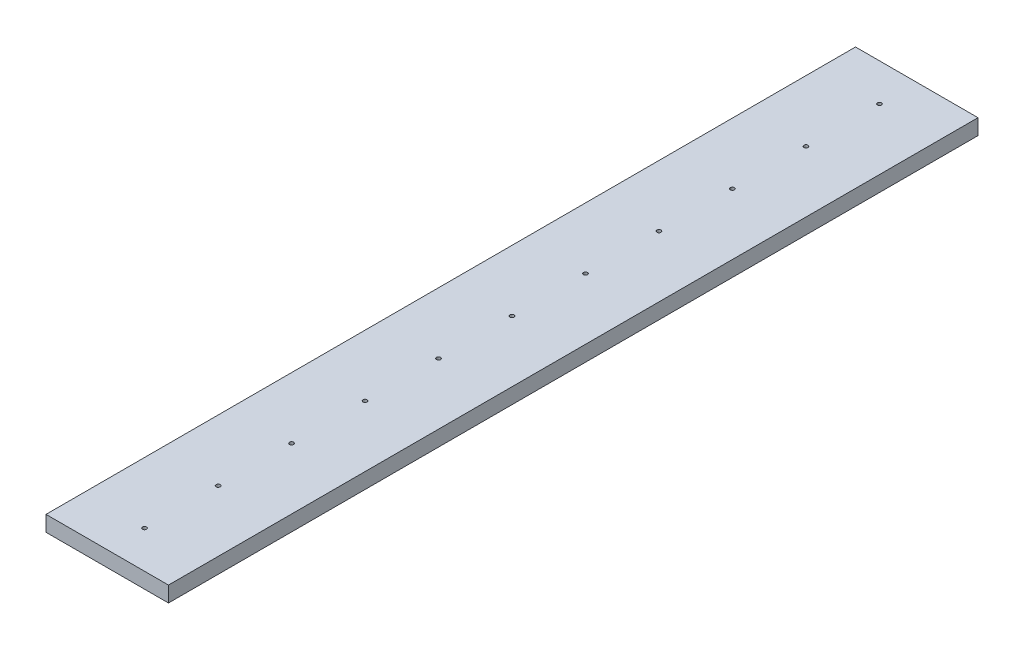
ISO-10303-21;
HEADER;
FILE_DESCRIPTION(('STEP AP214'),'2;1');
FILE_NAME('part.step','',(''),(''),'','','');
FILE_SCHEMA(('AUTOMOTIVE_DESIGN { 1 0 10303 214 1 1 1 1 }'));
ENDSEC;
DATA;
#1=APPLICATION_CONTEXT('core data for automotive mechanical design processes');
#2=APPLICATION_PROTOCOL_DEFINITION('international standard','automotive_design',2000,#1);
#3=PRODUCT_CONTEXT('',#1,'mechanical');
#4=PRODUCT('Part','Part','',(#3));
#5=PRODUCT_RELATED_PRODUCT_CATEGORY('part','',(#4));
#6=PRODUCT_DEFINITION_FORMATION('','',#4);
#7=PRODUCT_DEFINITION_CONTEXT('part definition',#1,'design');
#8=PRODUCT_DEFINITION('design','',#6,#7);
#9=PRODUCT_DEFINITION_SHAPE('','',#8);
#10=(LENGTH_UNIT() NAMED_UNIT(*) SI_UNIT(.MILLI.,.METRE.));
#11=(NAMED_UNIT(*) PLANE_ANGLE_UNIT() SI_UNIT($,.RADIAN.));
#12=(NAMED_UNIT(*) SI_UNIT($,.STERADIAN.) SOLID_ANGLE_UNIT());
#13=UNCERTAINTY_MEASURE_WITH_UNIT(LENGTH_MEASURE(1.E-05),#10,'distance_accuracy_value','');
#14=(GEOMETRIC_REPRESENTATION_CONTEXT(3) GLOBAL_UNCERTAINTY_ASSIGNED_CONTEXT((#13)) GLOBAL_UNIT_ASSIGNED_CONTEXT((#10,
#11,#12)) REPRESENTATION_CONTEXT('',''));
#15=CARTESIAN_POINT('',(0.,0.,0.));
#16=DIRECTION('',(0.,0.,1.));
#17=DIRECTION('',(1.,0.,0.));
#18=AXIS2_PLACEMENT_3D('',#15,#16,#17);
#19=CARTESIAN_POINT('',(-50.,12.7,-330.5));
#20=DIRECTION('',(1.,0.,0.));
#21=DIRECTION('',(0.,0.,-1.));
#22=AXIS2_PLACEMENT_3D('',#19,#20,#21);
#23=PLANE('',#22);
#24=DIRECTION('',(0.,0.,1.));
#25=VECTOR('',#24,1.);
#26=CARTESIAN_POINT('',(-50.,0.,-330.5));
#27=LINE('',#26,#25);
#28=CARTESIAN_POINT('',(-50.,0.,-330.5));
#29=VERTEX_POINT('',#28);
#30=CARTESIAN_POINT('',(-50.,0.,330.5));
#31=VERTEX_POINT('',#30);
#32=EDGE_CURVE('E229',#29,#31,#27,.T.);
#33=ORIENTED_EDGE('',*,*,#32,.T.);
#34=DIRECTION('',(0.,-1.,0.));
#35=VECTOR('',#34,1.);
#36=CARTESIAN_POINT('',(-50.,12.7,330.5));
#37=LINE('',#36,#35);
#38=CARTESIAN_POINT('',(-50.,12.7,330.5));
#39=VERTEX_POINT('',#38);
#40=EDGE_CURVE('E11',#39,#31,#37,.T.);
#41=ORIENTED_EDGE('',*,*,#40,.F.);
#42=DIRECTION('',(0.,0.,1.));
#43=VECTOR('',#42,1.);
#44=CARTESIAN_POINT('',(-50.,12.7,-330.5));
#45=LINE('',#44,#43);
#46=CARTESIAN_POINT('',(-50.,12.7,-330.5));
#47=VERTEX_POINT('',#46);
#48=EDGE_CURVE('E231',#47,#39,#45,.T.);
#49=ORIENTED_EDGE('',*,*,#48,.F.);
#50=DIRECTION('',(0.,-1.,0.));
#51=VECTOR('',#50,1.);
#52=CARTESIAN_POINT('',(-50.,12.7,-330.5));
#53=LINE('',#52,#51);
#54=EDGE_CURVE('E243',#47,#29,#53,.T.);
#55=ORIENTED_EDGE('',*,*,#54,.T.);
#56=EDGE_LOOP('',(#33,#41,#49,#55));
#57=FACE_BOUND('',#56,.T.);
#58=ADVANCED_FACE('F51',(#57),#23,.F.);
#59=CARTESIAN_POINT('',(50.,12.7,330.5));
#60=DIRECTION('',(0.,0.,-1.));
#61=DIRECTION('',(-1.,0.,0.));
#62=AXIS2_PLACEMENT_3D('',#59,#60,#61);
#63=PLANE('',#62);
#64=DIRECTION('',(1.,0.,0.));
#65=VECTOR('',#64,1.);
#66=CARTESIAN_POINT('',(50.,0.,330.5));
#67=LINE('',#66,#65);
#68=CARTESIAN_POINT('',(50.,0.,330.5));
#69=VERTEX_POINT('',#68);
#70=EDGE_CURVE('E244',#31,#69,#67,.T.);
#71=ORIENTED_EDGE('',*,*,#70,.T.);
#72=DIRECTION('',(0.,-1.,0.));
#73=VECTOR('',#72,1.);
#74=CARTESIAN_POINT('',(50.,12.7,330.5));
#75=LINE('',#74,#73);
#76=CARTESIAN_POINT('',(50.,12.7,330.5));
#77=VERTEX_POINT('',#76);
#78=EDGE_CURVE('E58',#77,#69,#75,.T.);
#79=ORIENTED_EDGE('',*,*,#78,.F.);
#80=DIRECTION('',(1.,0.,0.));
#81=VECTOR('',#80,1.);
#82=CARTESIAN_POINT('',(50.,12.7,330.5));
#83=LINE('',#82,#81);
#84=EDGE_CURVE('E98',#39,#77,#83,.T.);
#85=ORIENTED_EDGE('',*,*,#84,.F.);
#86=ORIENTED_EDGE('',*,*,#40,.T.);
#87=EDGE_LOOP('',(#71,#79,#85,#86));
#88=FACE_BOUND('',#87,.T.);
#89=ADVANCED_FACE('F276',(#88),#63,.F.);
#90=CARTESIAN_POINT('',(50.,12.7,-330.5));
#91=DIRECTION('',(-1.,0.,0.));
#92=DIRECTION('',(0.,0.,1.));
#93=AXIS2_PLACEMENT_3D('',#90,#91,#92);
#94=PLANE('',#93);
#95=DIRECTION('',(0.,0.,-1.));
#96=VECTOR('',#95,1.);
#97=CARTESIAN_POINT('',(50.,0.,-330.5));
#98=LINE('',#97,#96);
#99=CARTESIAN_POINT('',(50.,0.,-330.5));
#100=VERTEX_POINT('',#99);
#101=EDGE_CURVE('E86',#69,#100,#98,.T.);
#102=ORIENTED_EDGE('',*,*,#101,.T.);
#103=DIRECTION('',(0.,-1.,0.));
#104=VECTOR('',#103,1.);
#105=CARTESIAN_POINT('',(50.,12.7,-330.5));
#106=LINE('',#105,#104);
#107=CARTESIAN_POINT('',(50.,12.7,-330.5));
#108=VERTEX_POINT('',#107);
#109=EDGE_CURVE('E252',#108,#100,#106,.T.);
#110=ORIENTED_EDGE('',*,*,#109,.F.);
#111=DIRECTION('',(0.,0.,-1.));
#112=VECTOR('',#111,1.);
#113=CARTESIAN_POINT('',(50.,12.7,-330.5));
#114=LINE('',#113,#112);
#115=EDGE_CURVE('E237',#77,#108,#114,.T.);
#116=ORIENTED_EDGE('',*,*,#115,.F.);
#117=ORIENTED_EDGE('',*,*,#78,.T.);
#118=EDGE_LOOP('',(#102,#110,#116,#117));
#119=FACE_BOUND('',#118,.T.);
#120=ADVANCED_FACE('F256',(#119),#94,.F.);
#121=CARTESIAN_POINT('',(50.,12.7,-330.5));
#122=DIRECTION('',(0.,0.,1.));
#123=DIRECTION('',(1.,0.,0.));
#124=AXIS2_PLACEMENT_3D('',#121,#122,#123);
#125=PLANE('',#124);
#126=DIRECTION('',(-1.,0.,0.));
#127=VECTOR('',#126,1.);
#128=CARTESIAN_POINT('',(50.,0.,-330.5));
#129=LINE('',#128,#127);
#130=EDGE_CURVE('E95',#100,#29,#129,.T.);
#131=ORIENTED_EDGE('',*,*,#130,.T.);
#132=ORIENTED_EDGE('',*,*,#54,.F.);
#133=DIRECTION('',(-1.,0.,0.));
#134=VECTOR('',#133,1.);
#135=CARTESIAN_POINT('',(50.,12.7,-330.5));
#136=LINE('',#135,#134);
#137=EDGE_CURVE('E66',#108,#47,#136,.T.);
#138=ORIENTED_EDGE('',*,*,#137,.F.);
#139=ORIENTED_EDGE('',*,*,#109,.T.);
#140=EDGE_LOOP('',(#131,#132,#138,#139));
#141=FACE_BOUND('',#140,.T.);
#142=ADVANCED_FACE('F262',(#141),#125,.F.);
#143=CARTESIAN_POINT('',(0.,12.7,0.));
#144=DIRECTION('',(0.,-1.,0.));
#145=DIRECTION('',(0.,0.,-1.));
#146=AXIS2_PLACEMENT_3D('',#143,#144,#145);
#147=PLANE('',#146);
#148=CARTESIAN_POINT('',(0.,12.7,0.));
#149=DIRECTION('',(0.,1.,0.));
#150=DIRECTION('',(0.,0.,1.));
#151=AXIS2_PLACEMENT_3D('',#148,#149,#150);
#152=CIRCLE('',#151,1.65);
#153=CARTESIAN_POINT('',(0.,12.7,1.65));
#154=VERTEX_POINT('',#153);
#155=EDGE_CURVE('E144',#154,#154,#152,.T.);
#156=ORIENTED_EDGE('',*,*,#155,.F.);
#157=EDGE_LOOP('',(#156));
#158=FACE_BOUND('',#157,.T.);
#159=CARTESIAN_POINT('',(0.,12.7,300.));
#160=DIRECTION('',(0.,1.,0.));
#161=DIRECTION('',(0.,0.,1.));
#162=AXIS2_PLACEMENT_3D('',#159,#160,#161);
#163=CIRCLE('',#162,1.65);
#164=CARTESIAN_POINT('',(0.,12.7,301.65));
#165=VERTEX_POINT('',#164);
#166=EDGE_CURVE('E143',#165,#165,#163,.T.);
#167=ORIENTED_EDGE('',*,*,#166,.F.);
#168=EDGE_LOOP('',(#167));
#169=FACE_BOUND('',#168,.T.);
#170=CARTESIAN_POINT('',(0.,12.7,240.));
#171=DIRECTION('',(0.,1.,0.));
#172=DIRECTION('',(0.,0.,1.));
#173=AXIS2_PLACEMENT_3D('',#170,#171,#172);
#174=CIRCLE('',#173,1.65);
#175=CARTESIAN_POINT('',(0.,12.7,241.65));
#176=VERTEX_POINT('',#175);
#177=EDGE_CURVE('E156',#176,#176,#174,.T.);
#178=ORIENTED_EDGE('',*,*,#177,.F.);
#179=EDGE_LOOP('',(#178));
#180=FACE_BOUND('',#179,.T.);
#181=CARTESIAN_POINT('',(0.,12.7,180.));
#182=DIRECTION('',(0.,1.,0.));
#183=DIRECTION('',(0.,0.,1.));
#184=AXIS2_PLACEMENT_3D('',#181,#182,#183);
#185=CIRCLE('',#184,1.65);
#186=CARTESIAN_POINT('',(0.,12.7,181.65));
#187=VERTEX_POINT('',#186);
#188=EDGE_CURVE('E168',#187,#187,#185,.T.);
#189=ORIENTED_EDGE('',*,*,#188,.F.);
#190=EDGE_LOOP('',(#189));
#191=FACE_BOUND('',#190,.T.);
#192=CARTESIAN_POINT('',(0.,12.7,120.));
#193=DIRECTION('',(0.,1.,0.));
#194=DIRECTION('',(0.,0.,1.));
#195=AXIS2_PLACEMENT_3D('',#192,#193,#194);
#196=CIRCLE('',#195,1.65);
#197=CARTESIAN_POINT('',(0.,12.7,121.65));
#198=VERTEX_POINT('',#197);
#199=EDGE_CURVE('E174',#198,#198,#196,.T.);
#200=ORIENTED_EDGE('',*,*,#199,.F.);
#201=EDGE_LOOP('',(#200));
#202=FACE_BOUND('',#201,.T.);
#203=CARTESIAN_POINT('',(0.,12.7,60.));
#204=DIRECTION('',(0.,1.,0.));
#205=DIRECTION('',(0.,0.,1.));
#206=AXIS2_PLACEMENT_3D('',#203,#204,#205);
#207=CIRCLE('',#206,1.65);
#208=CARTESIAN_POINT('',(0.,12.7,61.65));
#209=VERTEX_POINT('',#208);
#210=EDGE_CURVE('E185',#209,#209,#207,.T.);
#211=ORIENTED_EDGE('',*,*,#210,.F.);
#212=EDGE_LOOP('',(#211));
#213=FACE_BOUND('',#212,.T.);
#214=CARTESIAN_POINT('',(0.,12.7,-60.));
#215=DIRECTION('',(0.,1.,0.));
#216=DIRECTION('',(0.,0.,1.));
#217=AXIS2_PLACEMENT_3D('',#214,#215,#216);
#218=CIRCLE('',#217,1.65);
#219=CARTESIAN_POINT('',(0.,12.7,-58.35));
#220=VERTEX_POINT('',#219);
#221=EDGE_CURVE('E189',#220,#220,#218,.T.);
#222=ORIENTED_EDGE('',*,*,#221,.F.);
#223=EDGE_LOOP('',(#222));
#224=FACE_BOUND('',#223,.T.);
#225=CARTESIAN_POINT('',(0.,12.7,-120.));
#226=DIRECTION('',(0.,1.,0.));
#227=DIRECTION('',(0.,0.,1.));
#228=AXIS2_PLACEMENT_3D('',#225,#226,#227);
#229=CIRCLE('',#228,1.65);
#230=CARTESIAN_POINT('',(0.,12.7,-118.35));
#231=VERTEX_POINT('',#230);
#232=EDGE_CURVE('E196',#231,#231,#229,.T.);
#233=ORIENTED_EDGE('',*,*,#232,.F.);
#234=EDGE_LOOP('',(#233));
#235=FACE_BOUND('',#234,.T.);
#236=CARTESIAN_POINT('',(0.,12.7,-180.));
#237=DIRECTION('',(0.,1.,0.));
#238=DIRECTION('',(0.,0.,1.));
#239=AXIS2_PLACEMENT_3D('',#236,#237,#238);
#240=CIRCLE('',#239,1.65);
#241=CARTESIAN_POINT('',(0.,12.7,-178.35));
#242=VERTEX_POINT('',#241);
#243=EDGE_CURVE('E208',#242,#242,#240,.T.);
#244=ORIENTED_EDGE('',*,*,#243,.F.);
#245=EDGE_LOOP('',(#244));
#246=FACE_BOUND('',#245,.T.);
#247=CARTESIAN_POINT('',(0.,12.7,-240.));
#248=DIRECTION('',(0.,1.,0.));
#249=DIRECTION('',(0.,0.,1.));
#250=AXIS2_PLACEMENT_3D('',#247,#248,#249);
#251=CIRCLE('',#250,1.65);
#252=CARTESIAN_POINT('',(0.,12.7,-238.35));
#253=VERTEX_POINT('',#252);
#254=EDGE_CURVE('E215',#253,#253,#251,.T.);
#255=ORIENTED_EDGE('',*,*,#254,.F.);
#256=EDGE_LOOP('',(#255));
#257=FACE_BOUND('',#256,.T.);
#258=CARTESIAN_POINT('',(0.,12.7,-300.));
#259=DIRECTION('',(0.,1.,0.));
#260=DIRECTION('',(0.,0.,1.));
#261=AXIS2_PLACEMENT_3D('',#258,#259,#260);
#262=CIRCLE('',#261,1.65);
#263=CARTESIAN_POINT('',(0.,12.7,-298.35));
#264=VERTEX_POINT('',#263);
#265=EDGE_CURVE('E225',#264,#264,#262,.T.);
#266=ORIENTED_EDGE('',*,*,#265,.F.);
#267=EDGE_LOOP('',(#266));
#268=FACE_BOUND('',#267,.T.);
#269=ORIENTED_EDGE('',*,*,#48,.T.);
#270=ORIENTED_EDGE('',*,*,#84,.T.);
#271=ORIENTED_EDGE('',*,*,#115,.T.);
#272=ORIENTED_EDGE('',*,*,#137,.T.);
#273=EDGE_LOOP('',(#269,#270,#271,#272));
#274=FACE_BOUND('',#273,.T.);
#275=ADVANCED_FACE('F270',(#158,#169,#180,#191,#202,#213,#224,#235,#246,#257,#268,#274),#147,.F.);
#276=CARTESIAN_POINT('',(0.,0.,0.));
#277=DIRECTION('',(0.,-1.,0.));
#278=DIRECTION('',(0.,0.,-1.));
#279=AXIS2_PLACEMENT_3D('',#276,#277,#278);
#280=PLANE('',#279);
#281=ORIENTED_EDGE('',*,*,#32,.F.);
#282=ORIENTED_EDGE('',*,*,#130,.F.);
#283=ORIENTED_EDGE('',*,*,#101,.F.);
#284=ORIENTED_EDGE('',*,*,#70,.F.);
#285=EDGE_LOOP('',(#281,#282,#283,#284));
#286=FACE_BOUND('',#285,.T.);
#287=ADVANCED_FACE('F263',(#286),#280,.T.);
#288=CARTESIAN_POINT('',(0.,2.6,-300.));
#289=DIRECTION('',(0.,1.,0.));
#290=DIRECTION('',(0.,0.,1.));
#291=AXIS2_PLACEMENT_3D('',#288,#289,#290);
#292=CONICAL_SURFACE('',#291,1.65,1.02974425867665);
#293=CARTESIAN_POINT('',(0.,1.60857997860452,-300.));
#294=VERTEX_POINT('',#293);
#295=VERTEX_LOOP('',#294);
#296=FACE_BOUND('',#295,.T.);
#297=CARTESIAN_POINT('',(0.,2.6,-300.));
#298=DIRECTION('',(0.,1.,0.));
#299=DIRECTION('',(0.,0.,1.));
#300=AXIS2_PLACEMENT_3D('',#297,#298,#299);
#301=CIRCLE('',#300,1.65);
#302=CARTESIAN_POINT('',(0.,2.6,-298.35));
#303=VERTEX_POINT('',#302);
#304=EDGE_CURVE('E226',#303,#303,#301,.T.);
#305=ORIENTED_EDGE('',*,*,#304,.T.);
#306=EDGE_LOOP('',(#305));
#307=FACE_BOUND('',#306,.T.);
#308=ADVANCED_FACE('F315',(#296,#307),#292,.F.);
#309=CARTESIAN_POINT('',(0.,12.7,-300.));
#310=DIRECTION('',(0.,1.,0.));
#311=DIRECTION('',(0.,0.,1.));
#312=AXIS2_PLACEMENT_3D('',#309,#310,#311);
#313=CYLINDRICAL_SURFACE('',#312,1.65);
#314=ORIENTED_EDGE('',*,*,#304,.F.);
#315=EDGE_LOOP('',(#314));
#316=FACE_BOUND('',#315,.T.);
#317=ORIENTED_EDGE('',*,*,#265,.T.);
#318=EDGE_LOOP('',(#317));
#319=FACE_BOUND('',#318,.T.);
#320=ADVANCED_FACE('F317',(#316,#319),#313,.F.);
#321=CARTESIAN_POINT('',(0.,2.6,-240.));
#322=DIRECTION('',(0.,1.,0.));
#323=DIRECTION('',(0.,0.,1.));
#324=AXIS2_PLACEMENT_3D('',#321,#322,#323);
#325=CONICAL_SURFACE('',#324,1.65,1.02974425867665);
#326=CARTESIAN_POINT('',(0.,1.60857997860452,-240.));
#327=VERTEX_POINT('',#326);
#328=VERTEX_LOOP('',#327);
#329=FACE_BOUND('',#328,.T.);
#330=CARTESIAN_POINT('',(0.,2.6,-240.));
#331=DIRECTION('',(0.,1.,0.));
#332=DIRECTION('',(0.,0.,1.));
#333=AXIS2_PLACEMENT_3D('',#330,#331,#332);
#334=CIRCLE('',#333,1.65);
#335=CARTESIAN_POINT('',(0.,2.6,-238.35));
#336=VERTEX_POINT('',#335);
#337=EDGE_CURVE('E216',#336,#336,#334,.T.);
#338=ORIENTED_EDGE('',*,*,#337,.T.);
#339=EDGE_LOOP('',(#338));
#340=FACE_BOUND('',#339,.T.);
#341=ADVANCED_FACE('F328',(#329,#340),#325,.F.);
#342=CARTESIAN_POINT('',(0.,12.7,-240.));
#343=DIRECTION('',(0.,1.,0.));
#344=DIRECTION('',(0.,0.,1.));
#345=AXIS2_PLACEMENT_3D('',#342,#343,#344);
#346=CYLINDRICAL_SURFACE('',#345,1.65);
#347=ORIENTED_EDGE('',*,*,#337,.F.);
#348=EDGE_LOOP('',(#347));
#349=FACE_BOUND('',#348,.T.);
#350=ORIENTED_EDGE('',*,*,#254,.T.);
#351=EDGE_LOOP('',(#350));
#352=FACE_BOUND('',#351,.T.);
#353=ADVANCED_FACE('F343',(#349,#352),#346,.F.);
#354=CARTESIAN_POINT('',(0.,2.6,-180.));
#355=DIRECTION('',(0.,1.,0.));
#356=DIRECTION('',(0.,0.,1.));
#357=AXIS2_PLACEMENT_3D('',#354,#355,#356);
#358=CONICAL_SURFACE('',#357,1.65,1.02974425867665);
#359=CARTESIAN_POINT('',(0.,1.60857997860452,-180.));
#360=VERTEX_POINT('',#359);
#361=VERTEX_LOOP('',#360);
#362=FACE_BOUND('',#361,.T.);
#363=CARTESIAN_POINT('',(0.,2.6,-180.));
#364=DIRECTION('',(0.,1.,0.));
#365=DIRECTION('',(0.,0.,1.));
#366=AXIS2_PLACEMENT_3D('',#363,#364,#365);
#367=CIRCLE('',#366,1.65);
#368=CARTESIAN_POINT('',(0.,2.6,-178.35));
#369=VERTEX_POINT('',#368);
#370=EDGE_CURVE('E209',#369,#369,#367,.T.);
#371=ORIENTED_EDGE('',*,*,#370,.T.);
#372=EDGE_LOOP('',(#371));
#373=FACE_BOUND('',#372,.T.);
#374=ADVANCED_FACE('F355',(#362,#373),#358,.F.);
#375=CARTESIAN_POINT('',(0.,12.7,-180.));
#376=DIRECTION('',(0.,1.,0.));
#377=DIRECTION('',(0.,0.,1.));
#378=AXIS2_PLACEMENT_3D('',#375,#376,#377);
#379=CYLINDRICAL_SURFACE('',#378,1.65);
#380=ORIENTED_EDGE('',*,*,#370,.F.);
#381=EDGE_LOOP('',(#380));
#382=FACE_BOUND('',#381,.T.);
#383=ORIENTED_EDGE('',*,*,#243,.T.);
#384=EDGE_LOOP('',(#383));
#385=FACE_BOUND('',#384,.T.);
#386=ADVANCED_FACE('F363',(#382,#385),#379,.F.);
#387=CARTESIAN_POINT('',(0.,2.6,-120.));
#388=DIRECTION('',(0.,1.,0.));
#389=DIRECTION('',(0.,0.,1.));
#390=AXIS2_PLACEMENT_3D('',#387,#388,#389);
#391=CONICAL_SURFACE('',#390,1.65,1.02974425867665);
#392=CARTESIAN_POINT('',(0.,1.60857997860452,-120.));
#393=VERTEX_POINT('',#392);
#394=VERTEX_LOOP('',#393);
#395=FACE_BOUND('',#394,.T.);
#396=CARTESIAN_POINT('',(0.,2.6,-120.));
#397=DIRECTION('',(0.,1.,0.));
#398=DIRECTION('',(0.,0.,1.));
#399=AXIS2_PLACEMENT_3D('',#396,#397,#398);
#400=CIRCLE('',#399,1.65);
#401=CARTESIAN_POINT('',(0.,2.6,-118.35));
#402=VERTEX_POINT('',#401);
#403=EDGE_CURVE('E205',#402,#402,#400,.T.);
#404=ORIENTED_EDGE('',*,*,#403,.T.);
#405=EDGE_LOOP('',(#404));
#406=FACE_BOUND('',#405,.T.);
#407=ADVANCED_FACE('F371',(#395,#406),#391,.F.);
#408=CARTESIAN_POINT('',(0.,12.7,-120.));
#409=DIRECTION('',(0.,1.,0.));
#410=DIRECTION('',(0.,0.,1.));
#411=AXIS2_PLACEMENT_3D('',#408,#409,#410);
#412=CYLINDRICAL_SURFACE('',#411,1.65);
#413=ORIENTED_EDGE('',*,*,#403,.F.);
#414=EDGE_LOOP('',(#413));
#415=FACE_BOUND('',#414,.T.);
#416=ORIENTED_EDGE('',*,*,#232,.T.);
#417=EDGE_LOOP('',(#416));
#418=FACE_BOUND('',#417,.T.);
#419=ADVANCED_FACE('F383',(#415,#418),#412,.F.);
#420=CARTESIAN_POINT('',(0.,2.6,-60.));
#421=DIRECTION('',(0.,1.,0.));
#422=DIRECTION('',(0.,0.,1.));
#423=AXIS2_PLACEMENT_3D('',#420,#421,#422);
#424=CONICAL_SURFACE('',#423,1.65,1.02974425867665);
#425=CARTESIAN_POINT('',(0.,1.60857997860452,-60.));
#426=VERTEX_POINT('',#425);
#427=VERTEX_LOOP('',#426);
#428=FACE_BOUND('',#427,.T.);
#429=CARTESIAN_POINT('',(0.,2.6,-60.));
#430=DIRECTION('',(0.,1.,0.));
#431=DIRECTION('',(0.,0.,1.));
#432=AXIS2_PLACEMENT_3D('',#429,#430,#431);
#433=CIRCLE('',#432,1.65);
#434=CARTESIAN_POINT('',(0.,2.6,-58.35));
#435=VERTEX_POINT('',#434);
#436=EDGE_CURVE('E191',#435,#435,#433,.T.);
#437=ORIENTED_EDGE('',*,*,#436,.T.);
#438=EDGE_LOOP('',(#437));
#439=FACE_BOUND('',#438,.T.);
#440=ADVANCED_FACE('F398',(#428,#439),#424,.F.);
#441=CARTESIAN_POINT('',(0.,12.7,-60.));
#442=DIRECTION('',(0.,1.,0.));
#443=DIRECTION('',(0.,0.,1.));
#444=AXIS2_PLACEMENT_3D('',#441,#442,#443);
#445=CYLINDRICAL_SURFACE('',#444,1.65);
#446=ORIENTED_EDGE('',*,*,#436,.F.);
#447=EDGE_LOOP('',(#446));
#448=FACE_BOUND('',#447,.T.);
#449=ORIENTED_EDGE('',*,*,#221,.T.);
#450=EDGE_LOOP('',(#449));
#451=FACE_BOUND('',#450,.T.);
#452=ADVANCED_FACE('F410',(#448,#451),#445,.F.);
#453=CARTESIAN_POINT('',(0.,2.6,60.));
#454=DIRECTION('',(0.,1.,0.));
#455=DIRECTION('',(0.,0.,1.));
#456=AXIS2_PLACEMENT_3D('',#453,#454,#455);
#457=CONICAL_SURFACE('',#456,1.65,1.02974425867665);
#458=CARTESIAN_POINT('',(0.,1.60857997860452,60.));
#459=VERTEX_POINT('',#458);
#460=VERTEX_LOOP('',#459);
#461=FACE_BOUND('',#460,.T.);
#462=CARTESIAN_POINT('',(0.,2.6,60.));
#463=DIRECTION('',(0.,1.,0.));
#464=DIRECTION('',(0.,0.,1.));
#465=AXIS2_PLACEMENT_3D('',#462,#463,#464);
#466=CIRCLE('',#465,1.65);
#467=CARTESIAN_POINT('',(0.,2.6,61.65));
#468=VERTEX_POINT('',#467);
#469=EDGE_CURVE('E186',#468,#468,#466,.T.);
#470=ORIENTED_EDGE('',*,*,#469,.T.);
#471=EDGE_LOOP('',(#470));
#472=FACE_BOUND('',#471,.T.);
#473=ADVANCED_FACE('F419',(#461,#472),#457,.F.);
#474=CARTESIAN_POINT('',(0.,12.7,60.));
#475=DIRECTION('',(0.,1.,0.));
#476=DIRECTION('',(0.,0.,1.));
#477=AXIS2_PLACEMENT_3D('',#474,#475,#476);
#478=CYLINDRICAL_SURFACE('',#477,1.65);
#479=ORIENTED_EDGE('',*,*,#469,.F.);
#480=EDGE_LOOP('',(#479));
#481=FACE_BOUND('',#480,.T.);
#482=ORIENTED_EDGE('',*,*,#210,.T.);
#483=EDGE_LOOP('',(#482));
#484=FACE_BOUND('',#483,.T.);
#485=ADVANCED_FACE('F429',(#481,#484),#478,.F.);
#486=CARTESIAN_POINT('',(0.,2.6,120.));
#487=DIRECTION('',(0.,1.,0.));
#488=DIRECTION('',(0.,0.,1.));
#489=AXIS2_PLACEMENT_3D('',#486,#487,#488);
#490=CONICAL_SURFACE('',#489,1.65,1.02974425867665);
#491=CARTESIAN_POINT('',(0.,1.60857997860452,120.));
#492=VERTEX_POINT('',#491);
#493=VERTEX_LOOP('',#492);
#494=FACE_BOUND('',#493,.T.);
#495=CARTESIAN_POINT('',(0.,2.6,120.));
#496=DIRECTION('',(0.,1.,0.));
#497=DIRECTION('',(0.,0.,1.));
#498=AXIS2_PLACEMENT_3D('',#495,#496,#497);
#499=CIRCLE('',#498,1.65);
#500=CARTESIAN_POINT('',(0.,2.6,121.65));
#501=VERTEX_POINT('',#500);
#502=EDGE_CURVE('E178',#501,#501,#499,.T.);
#503=ORIENTED_EDGE('',*,*,#502,.T.);
#504=EDGE_LOOP('',(#503));
#505=FACE_BOUND('',#504,.T.);
#506=ADVANCED_FACE('F439',(#494,#505),#490,.F.);
#507=CARTESIAN_POINT('',(0.,12.7,120.));
#508=DIRECTION('',(0.,1.,0.));
#509=DIRECTION('',(0.,0.,1.));
#510=AXIS2_PLACEMENT_3D('',#507,#508,#509);
#511=CYLINDRICAL_SURFACE('',#510,1.65);
#512=ORIENTED_EDGE('',*,*,#502,.F.);
#513=EDGE_LOOP('',(#512));
#514=FACE_BOUND('',#513,.T.);
#515=ORIENTED_EDGE('',*,*,#199,.T.);
#516=EDGE_LOOP('',(#515));
#517=FACE_BOUND('',#516,.T.);
#518=ADVANCED_FACE('F451',(#514,#517),#511,.F.);
#519=CARTESIAN_POINT('',(0.,2.6,180.));
#520=DIRECTION('',(0.,1.,0.));
#521=DIRECTION('',(0.,0.,1.));
#522=AXIS2_PLACEMENT_3D('',#519,#520,#521);
#523=CONICAL_SURFACE('',#522,1.65,1.02974425867665);
#524=CARTESIAN_POINT('',(0.,1.60857997860452,180.));
#525=VERTEX_POINT('',#524);
#526=VERTEX_LOOP('',#525);
#527=FACE_BOUND('',#526,.T.);
#528=CARTESIAN_POINT('',(0.,2.6,180.));
#529=DIRECTION('',(0.,1.,0.));
#530=DIRECTION('',(0.,0.,1.));
#531=AXIS2_PLACEMENT_3D('',#528,#529,#530);
#532=CIRCLE('',#531,1.65);
#533=CARTESIAN_POINT('',(0.,2.6,181.65));
#534=VERTEX_POINT('',#533);
#535=EDGE_CURVE('E169',#534,#534,#532,.T.);
#536=ORIENTED_EDGE('',*,*,#535,.T.);
#537=EDGE_LOOP('',(#536));
#538=FACE_BOUND('',#537,.T.);
#539=ADVANCED_FACE('F465',(#527,#538),#523,.F.);
#540=CARTESIAN_POINT('',(0.,12.7,180.));
#541=DIRECTION('',(0.,1.,0.));
#542=DIRECTION('',(0.,0.,1.));
#543=AXIS2_PLACEMENT_3D('',#540,#541,#542);
#544=CYLINDRICAL_SURFACE('',#543,1.65);
#545=ORIENTED_EDGE('',*,*,#535,.F.);
#546=EDGE_LOOP('',(#545));
#547=FACE_BOUND('',#546,.T.);
#548=ORIENTED_EDGE('',*,*,#188,.T.);
#549=EDGE_LOOP('',(#548));
#550=FACE_BOUND('',#549,.T.);
#551=ADVANCED_FACE('F471',(#547,#550),#544,.F.);
#552=CARTESIAN_POINT('',(0.,2.6,240.));
#553=DIRECTION('',(0.,1.,0.));
#554=DIRECTION('',(0.,0.,1.));
#555=AXIS2_PLACEMENT_3D('',#552,#553,#554);
#556=CONICAL_SURFACE('',#555,1.65,1.02974425867665);
#557=CARTESIAN_POINT('',(0.,1.60857997860452,240.));
#558=VERTEX_POINT('',#557);
#559=VERTEX_LOOP('',#558);
#560=FACE_BOUND('',#559,.T.);
#561=CARTESIAN_POINT('',(0.,2.6,240.));
#562=DIRECTION('',(0.,1.,0.));
#563=DIRECTION('',(0.,0.,1.));
#564=AXIS2_PLACEMENT_3D('',#561,#562,#563);
#565=CIRCLE('',#564,1.65);
#566=CARTESIAN_POINT('',(0.,2.6,241.65));
#567=VERTEX_POINT('',#566);
#568=EDGE_CURVE('E165',#567,#567,#565,.T.);
#569=ORIENTED_EDGE('',*,*,#568,.T.);
#570=EDGE_LOOP('',(#569));
#571=FACE_BOUND('',#570,.T.);
#572=ADVANCED_FACE('F485',(#560,#571),#556,.F.);
#573=CARTESIAN_POINT('',(0.,12.7,240.));
#574=DIRECTION('',(0.,1.,0.));
#575=DIRECTION('',(0.,0.,1.));
#576=AXIS2_PLACEMENT_3D('',#573,#574,#575);
#577=CYLINDRICAL_SURFACE('',#576,1.65);
#578=ORIENTED_EDGE('',*,*,#568,.F.);
#579=EDGE_LOOP('',(#578));
#580=FACE_BOUND('',#579,.T.);
#581=ORIENTED_EDGE('',*,*,#177,.T.);
#582=EDGE_LOOP('',(#581));
#583=FACE_BOUND('',#582,.T.);
#584=ADVANCED_FACE('F494',(#580,#583),#577,.F.);
#585=CARTESIAN_POINT('',(0.,2.6,300.));
#586=DIRECTION('',(0.,1.,0.));
#587=DIRECTION('',(0.,0.,1.));
#588=AXIS2_PLACEMENT_3D('',#585,#586,#587);
#589=CONICAL_SURFACE('',#588,1.65,1.02974425867665);
#590=CARTESIAN_POINT('',(0.,1.60857997860452,300.));
#591=VERTEX_POINT('',#590);
#592=VERTEX_LOOP('',#591);
#593=FACE_BOUND('',#592,.T.);
#594=CARTESIAN_POINT('',(0.,2.6,300.));
#595=DIRECTION('',(0.,1.,0.));
#596=DIRECTION('',(0.,0.,1.));
#597=AXIS2_PLACEMENT_3D('',#594,#595,#596);
#598=CIRCLE('',#597,1.65);
#599=CARTESIAN_POINT('',(0.,2.6,301.65));
#600=VERTEX_POINT('',#599);
#601=EDGE_CURVE('E148',#600,#600,#598,.T.);
#602=ORIENTED_EDGE('',*,*,#601,.T.);
#603=EDGE_LOOP('',(#602));
#604=FACE_BOUND('',#603,.T.);
#605=ADVANCED_FACE('F507',(#593,#604),#589,.F.);
#606=CARTESIAN_POINT('',(0.,12.7,300.));
#607=DIRECTION('',(0.,1.,0.));
#608=DIRECTION('',(0.,0.,1.));
#609=AXIS2_PLACEMENT_3D('',#606,#607,#608);
#610=CYLINDRICAL_SURFACE('',#609,1.65);
#611=ORIENTED_EDGE('',*,*,#601,.F.);
#612=EDGE_LOOP('',(#611));
#613=FACE_BOUND('',#612,.T.);
#614=ORIENTED_EDGE('',*,*,#166,.T.);
#615=EDGE_LOOP('',(#614));
#616=FACE_BOUND('',#615,.T.);
#617=ADVANCED_FACE('F140',(#613,#616),#610,.F.);
#618=CARTESIAN_POINT('',(0.,2.6,0.));
#619=DIRECTION('',(0.,1.,0.));
#620=DIRECTION('',(0.,0.,1.));
#621=AXIS2_PLACEMENT_3D('',#618,#619,#620);
#622=CONICAL_SURFACE('',#621,1.65,1.02974425867665);
#623=CARTESIAN_POINT('',(0.,1.60857997860452,0.));
#624=VERTEX_POINT('',#623);
#625=VERTEX_LOOP('',#624);
#626=FACE_BOUND('',#625,.T.);
#627=CARTESIAN_POINT('',(0.,2.6,0.));
#628=DIRECTION('',(0.,1.,0.));
#629=DIRECTION('',(0.,0.,1.));
#630=AXIS2_PLACEMENT_3D('',#627,#628,#629);
#631=CIRCLE('',#630,1.65);
#632=CARTESIAN_POINT('',(0.,2.6,1.65));
#633=VERTEX_POINT('',#632);
#634=EDGE_CURVE('E141',#633,#633,#631,.T.);
#635=ORIENTED_EDGE('',*,*,#634,.T.);
#636=EDGE_LOOP('',(#635));
#637=FACE_BOUND('',#636,.T.);
#638=ADVANCED_FACE('F133',(#626,#637),#622,.F.);
#639=CARTESIAN_POINT('',(0.,12.7,0.));
#640=DIRECTION('',(0.,1.,0.));
#641=DIRECTION('',(0.,0.,1.));
#642=AXIS2_PLACEMENT_3D('',#639,#640,#641);
#643=CYLINDRICAL_SURFACE('',#642,1.65);
#644=ORIENTED_EDGE('',*,*,#634,.F.);
#645=EDGE_LOOP('',(#644));
#646=FACE_BOUND('',#645,.T.);
#647=ORIENTED_EDGE('',*,*,#155,.T.);
#648=EDGE_LOOP('',(#647));
#649=FACE_BOUND('',#648,.T.);
#650=ADVANCED_FACE('F136',(#646,#649),#643,.F.);
#651=CLOSED_SHELL('',(#58,#89,#120,#142,#275,#287,#308,#320,#341,#353,#374,#386,#407,#419,#440,
#452,#473,#485,#506,#518,#539,#551,#572,#584,#605,#617,#638,#650));
#652=MANIFOLD_SOLID_BREP('B2',#651);
#653=ADVANCED_BREP_SHAPE_REPRESENTATION('',(#18,#652),#14);
#654=SHAPE_DEFINITION_REPRESENTATION(#9,#653);
ENDSEC;
END-ISO-10303-21;
